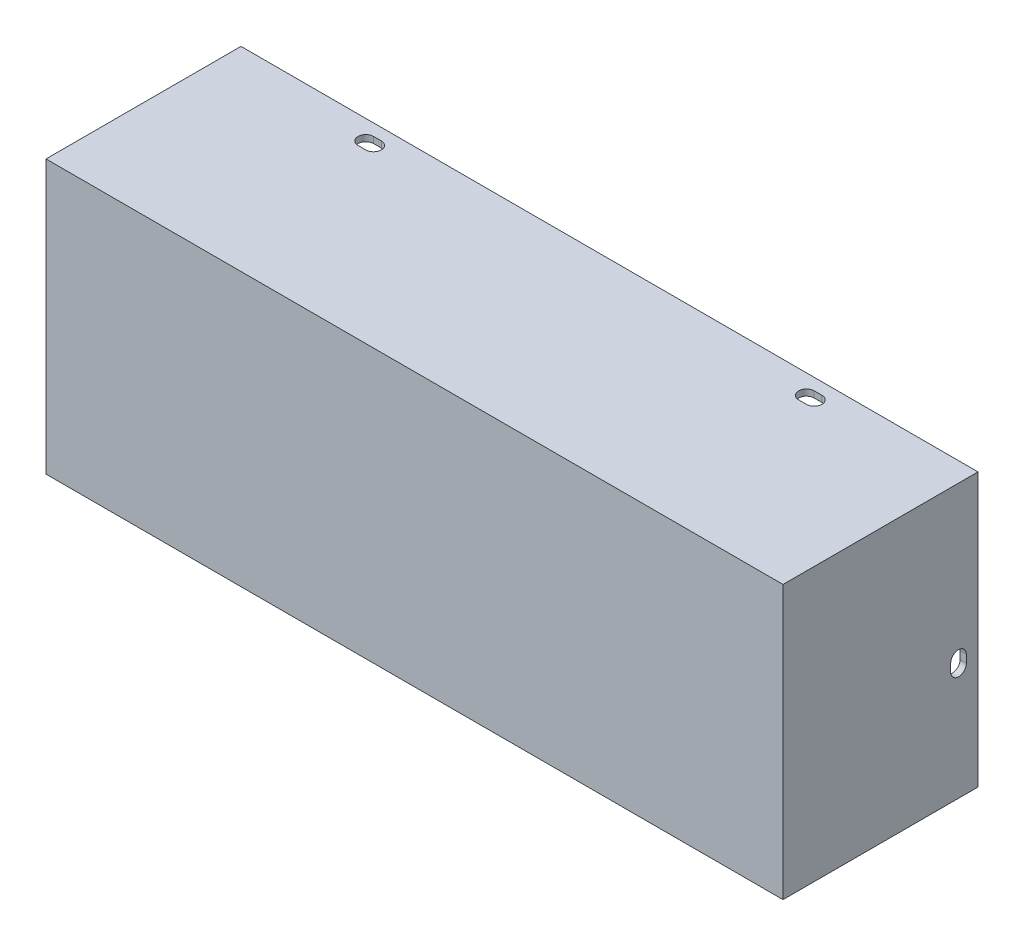
ISO-10303-21;
HEADER;
FILE_DESCRIPTION(('STEP AP214'),'2;1');
FILE_NAME('part.step','',(''),(''),'','','');
FILE_SCHEMA(('AUTOMOTIVE_DESIGN { 1 0 10303 214 1 1 1 1 }'));
ENDSEC;
DATA;
#1=APPLICATION_CONTEXT('core data for automotive mechanical design processes');
#2=APPLICATION_PROTOCOL_DEFINITION('international standard','automotive_design',2000,#1);
#3=PRODUCT_CONTEXT('',#1,'mechanical');
#4=PRODUCT('Part','Part','',(#3));
#5=PRODUCT_RELATED_PRODUCT_CATEGORY('part','',(#4));
#6=PRODUCT_DEFINITION_FORMATION('','',#4);
#7=PRODUCT_DEFINITION_CONTEXT('part definition',#1,'design');
#8=PRODUCT_DEFINITION('design','',#6,#7);
#9=PRODUCT_DEFINITION_SHAPE('','',#8);
#10=(LENGTH_UNIT() NAMED_UNIT(*) SI_UNIT(.MILLI.,.METRE.));
#11=(NAMED_UNIT(*) PLANE_ANGLE_UNIT() SI_UNIT($,.RADIAN.));
#12=(NAMED_UNIT(*) SI_UNIT($,.STERADIAN.) SOLID_ANGLE_UNIT());
#13=UNCERTAINTY_MEASURE_WITH_UNIT(LENGTH_MEASURE(1.E-05),#10,'distance_accuracy_value','');
#14=(GEOMETRIC_REPRESENTATION_CONTEXT(3) GLOBAL_UNCERTAINTY_ASSIGNED_CONTEXT((#13)) GLOBAL_UNIT_ASSIGNED_CONTEXT((#10,
#11,#12)) REPRESENTATION_CONTEXT('',''));
#15=CARTESIAN_POINT('',(0.,0.,0.));
#16=DIRECTION('',(0.,0.,1.));
#17=DIRECTION('',(1.,0.,0.));
#18=AXIS2_PLACEMENT_3D('',#15,#16,#17);
#19=CARTESIAN_POINT('',(-92.8,-33.9,48.4));
#20=DIRECTION('',(0.,0.,1.));
#21=DIRECTION('',(1.,0.,0.));
#22=AXIS2_PLACEMENT_3D('',#19,#20,#21);
#23=PLANE('',#22);
#24=DIRECTION('',(0.,1.,0.));
#25=VECTOR('',#24,1.);
#26=CARTESIAN_POINT('',(93.,32.9,48.4));
#27=LINE('',#26,#25);
#28=CARTESIAN_POINT('',(93.,-33.9,48.4));
#29=VERTEX_POINT('',#28);
#30=CARTESIAN_POINT('',(93.,32.9,48.4));
#31=VERTEX_POINT('',#30);
#32=EDGE_CURVE('E318',#29,#31,#27,.T.);
#33=ORIENTED_EDGE('',*,*,#32,.F.);
#34=DIRECTION('',(1.,0.,0.));
#35=VECTOR('',#34,1.);
#36=CARTESIAN_POINT('',(-92.8,-33.9,48.4));
#37=LINE('',#36,#35);
#38=CARTESIAN_POINT('',(-92.8,-33.9,48.4));
#39=VERTEX_POINT('',#38);
#40=EDGE_CURVE('E21',#39,#29,#37,.T.);
#41=ORIENTED_EDGE('',*,*,#40,.F.);
#42=DIRECTION('',(0.,-1.,0.));
#43=VECTOR('',#42,1.);
#44=CARTESIAN_POINT('',(-92.8,32.9,48.4));
#45=LINE('',#44,#43);
#46=CARTESIAN_POINT('',(-92.8,32.9,48.4));
#47=VERTEX_POINT('',#46);
#48=EDGE_CURVE('E324',#47,#39,#45,.T.);
#49=ORIENTED_EDGE('',*,*,#48,.F.);
#50=DIRECTION('',(-1.,0.,0.));
#51=VECTOR('',#50,1.);
#52=CARTESIAN_POINT('',(-92.8,32.9,48.4));
#53=LINE('',#52,#51);
#54=EDGE_CURVE('E11',#31,#47,#53,.T.);
#55=ORIENTED_EDGE('',*,*,#54,.F.);
#56=EDGE_LOOP('',(#33,#41,#49,#55));
#57=FACE_BOUND('',#56,.T.);
#58=ADVANCED_FACE('F17',(#57),#23,.F.);
#59=CARTESIAN_POINT('',(-92.8,32.9,48.4));
#60=DIRECTION('',(0.,-1.,0.));
#61=DIRECTION('',(0.,0.,-1.));
#62=AXIS2_PLACEMENT_3D('',#59,#60,#61);
#63=PLANE('',#62);
#64=CARTESIAN_POINT('',(57.6,32.9,5.));
#65=DIRECTION('',(0.,1.,0.));
#66=DIRECTION('',(0.,0.,1.));
#67=AXIS2_PLACEMENT_3D('',#64,#65,#66);
#68=CIRCLE('',#67,2.);
#69=CARTESIAN_POINT('',(57.6,32.9,7.));
#70=VERTEX_POINT('',#69);
#71=CARTESIAN_POINT('',(57.6,32.9,3.));
#72=VERTEX_POINT('',#71);
#73=EDGE_CURVE('E244',#70,#72,#68,.T.);
#74=ORIENTED_EDGE('',*,*,#73,.T.);
#75=DIRECTION('',(-1.,0.,0.));
#76=VECTOR('',#75,1.);
#77=CARTESIAN_POINT('',(55.6,32.9,3.));
#78=LINE('',#77,#76);
#79=CARTESIAN_POINT('',(55.6,32.9,3.));
#80=VERTEX_POINT('',#79);
#81=EDGE_CURVE('E252',#72,#80,#78,.T.);
#82=ORIENTED_EDGE('',*,*,#81,.T.);
#83=CARTESIAN_POINT('',(55.6,32.9,5.));
#84=DIRECTION('',(0.,1.,0.));
#85=DIRECTION('',(0.,0.,1.));
#86=AXIS2_PLACEMENT_3D('',#83,#84,#85);
#87=CIRCLE('',#86,2.);
#88=CARTESIAN_POINT('',(55.6,32.9,7.));
#89=VERTEX_POINT('',#88);
#90=EDGE_CURVE('E386',#80,#89,#87,.T.);
#91=ORIENTED_EDGE('',*,*,#90,.T.);
#92=DIRECTION('',(1.,0.,0.));
#93=VECTOR('',#92,1.);
#94=CARTESIAN_POINT('',(55.6,32.9,7.));
#95=LINE('',#94,#93);
#96=EDGE_CURVE('E329',#89,#70,#95,.T.);
#97=ORIENTED_EDGE('',*,*,#96,.T.);
#98=EDGE_LOOP('',(#74,#82,#91,#97));
#99=FACE_BOUND('',#98,.T.);
#100=CARTESIAN_POINT('',(-55.4,32.9,5.));
#101=DIRECTION('',(0.,1.,0.));
#102=DIRECTION('',(0.,0.,1.));
#103=AXIS2_PLACEMENT_3D('',#100,#101,#102);
#104=CIRCLE('',#103,2.);
#105=CARTESIAN_POINT('',(-55.4,32.9,7.));
#106=VERTEX_POINT('',#105);
#107=CARTESIAN_POINT('',(-55.4,32.9,3.));
#108=VERTEX_POINT('',#107);
#109=EDGE_CURVE('E40',#106,#108,#104,.T.);
#110=ORIENTED_EDGE('',*,*,#109,.T.);
#111=DIRECTION('',(-1.,0.,0.));
#112=VECTOR('',#111,1.);
#113=CARTESIAN_POINT('',(-57.4,32.9,3.));
#114=LINE('',#113,#112);
#115=CARTESIAN_POINT('',(-57.4,32.9,3.));
#116=VERTEX_POINT('',#115);
#117=EDGE_CURVE('E50',#108,#116,#114,.T.);
#118=ORIENTED_EDGE('',*,*,#117,.T.);
#119=CARTESIAN_POINT('',(-57.4,32.9,5.));
#120=DIRECTION('',(0.,1.,0.));
#121=DIRECTION('',(0.,0.,1.));
#122=AXIS2_PLACEMENT_3D('',#119,#120,#121);
#123=CIRCLE('',#122,2.);
#124=CARTESIAN_POINT('',(-57.4,32.9,7.));
#125=VERTEX_POINT('',#124);
#126=EDGE_CURVE('E219',#116,#125,#123,.T.);
#127=ORIENTED_EDGE('',*,*,#126,.T.);
#128=DIRECTION('',(1.,0.,0.));
#129=VECTOR('',#128,1.);
#130=CARTESIAN_POINT('',(-57.4,32.9,7.));
#131=LINE('',#130,#129);
#132=EDGE_CURVE('E222',#125,#106,#131,.T.);
#133=ORIENTED_EDGE('',*,*,#132,.T.);
#134=EDGE_LOOP('',(#110,#118,#127,#133));
#135=FACE_BOUND('',#134,.T.);
#136=DIRECTION('',(1.,0.,0.));
#137=VECTOR('',#136,1.);
#138=CARTESIAN_POINT('',(-92.8,32.9,0.));
#139=LINE('',#138,#137);
#140=CARTESIAN_POINT('',(-92.8,32.9,0.));
#141=VERTEX_POINT('',#140);
#142=CARTESIAN_POINT('',(93.,32.9,0.));
#143=VERTEX_POINT('',#142);
#144=EDGE_CURVE('E339',#141,#143,#139,.T.);
#145=ORIENTED_EDGE('',*,*,#144,.T.);
#146=DIRECTION('',(0.,0.,-1.));
#147=VECTOR('',#146,1.);
#148=CARTESIAN_POINT('',(93.,32.9,48.4));
#149=LINE('',#148,#147);
#150=EDGE_CURVE('E313',#31,#143,#149,.T.);
#151=ORIENTED_EDGE('',*,*,#150,.F.);
#152=ORIENTED_EDGE('',*,*,#54,.T.);
#153=DIRECTION('',(0.,0.,1.));
#154=VECTOR('',#153,1.);
#155=CARTESIAN_POINT('',(-92.8,32.9,48.4));
#156=LINE('',#155,#154);
#157=EDGE_CURVE('E360',#141,#47,#156,.T.);
#158=ORIENTED_EDGE('',*,*,#157,.F.);
#159=EDGE_LOOP('',(#145,#151,#152,#158));
#160=FACE_BOUND('',#159,.T.);
#161=ADVANCED_FACE('F19',(#99,#135,#160),#63,.T.);
#162=CARTESIAN_POINT('',(-92.8,-33.9,48.4));
#163=DIRECTION('',(0.,1.,0.));
#164=DIRECTION('',(1.,0.,0.));
#165=AXIS2_PLACEMENT_3D('',#162,#163,#164);
#166=PLANE('',#165);
#167=DIRECTION('',(0.,0.,1.));
#168=VECTOR('',#167,1.);
#169=CARTESIAN_POINT('',(93.,-33.9,48.4));
#170=LINE('',#169,#168);
#171=CARTESIAN_POINT('',(93.,-33.9,10.));
#172=VERTEX_POINT('',#171);
#173=EDGE_CURVE('E311',#172,#29,#170,.T.);
#174=ORIENTED_EDGE('',*,*,#173,.F.);
#175=DIRECTION('',(1.,0.,0.));
#176=VECTOR('',#175,1.);
#177=CARTESIAN_POINT('',(93.,-33.9,10.));
#178=LINE('',#177,#176);
#179=CARTESIAN_POINT('',(-92.8,-33.9,10.));
#180=VERTEX_POINT('',#179);
#181=EDGE_CURVE('E352',#180,#172,#178,.T.);
#182=ORIENTED_EDGE('',*,*,#181,.F.);
#183=DIRECTION('',(0.,0.,-1.));
#184=VECTOR('',#183,1.);
#185=CARTESIAN_POINT('',(-92.8,-33.9,48.4));
#186=LINE('',#185,#184);
#187=EDGE_CURVE('E319',#39,#180,#186,.T.);
#188=ORIENTED_EDGE('',*,*,#187,.F.);
#189=ORIENTED_EDGE('',*,*,#40,.T.);
#190=EDGE_LOOP('',(#174,#182,#188,#189));
#191=FACE_BOUND('',#190,.T.);
#192=ADVANCED_FACE('F1143',(#191),#166,.T.);
#193=CARTESIAN_POINT('',(-94.4,-4.5,7.));
#194=DIRECTION('',(0.,0.,1.));
#195=DIRECTION('',(1.,0.,0.));
#196=AXIS2_PLACEMENT_3D('',#193,#194,#195);
#197=PLANE('',#196);
#198=DIRECTION('',(0.,-1.,0.));
#199=VECTOR('',#198,1.);
#200=CARTESIAN_POINT('',(94.6,32.9,7.));
#201=LINE('',#200,#199);
#202=CARTESIAN_POINT('',(94.6,-4.5,7.));
#203=VERTEX_POINT('',#202);
#204=CARTESIAN_POINT('',(94.6,-6.5,7.));
#205=VERTEX_POINT('',#204);
#206=EDGE_CURVE('E312',#203,#205,#201,.T.);
#207=ORIENTED_EDGE('',*,*,#206,.T.);
#208=DIRECTION('',(-1.,0.,0.));
#209=VECTOR('',#208,1.);
#210=CARTESIAN_POINT('',(-94.4,-6.5,7.));
#211=LINE('',#210,#209);
#212=CARTESIAN_POINT('',(93.,-6.5,7.));
#213=VERTEX_POINT('',#212);
#214=EDGE_CURVE('E275',#205,#213,#211,.T.);
#215=ORIENTED_EDGE('',*,*,#214,.T.);
#216=DIRECTION('',(0.,-1.,0.));
#217=VECTOR('',#216,1.);
#218=CARTESIAN_POINT('',(93.,32.9,7.));
#219=LINE('',#218,#217);
#220=CARTESIAN_POINT('',(93.,-4.5,7.));
#221=VERTEX_POINT('',#220);
#222=EDGE_CURVE('E328',#221,#213,#219,.T.);
#223=ORIENTED_EDGE('',*,*,#222,.F.);
#224=DIRECTION('',(-1.,0.,0.));
#225=VECTOR('',#224,1.);
#226=CARTESIAN_POINT('',(-94.4,-4.5,7.));
#227=LINE('',#226,#225);
#228=EDGE_CURVE('E413',#203,#221,#227,.T.);
#229=ORIENTED_EDGE('',*,*,#228,.F.);
#230=EDGE_LOOP('',(#207,#215,#223,#229));
#231=FACE_BOUND('',#230,.T.);
#232=ADVANCED_FACE('F1087',(#231),#197,.F.);
#233=CARTESIAN_POINT('',(-94.4,-6.5,5.));
#234=DIRECTION('',(1.,0.,0.));
#235=DIRECTION('',(0.,1.,0.));
#236=AXIS2_PLACEMENT_3D('',#233,#234,#235);
#237=CYLINDRICAL_SURFACE('',#236,2.);
#238=CARTESIAN_POINT('',(94.6,-6.5,5.));
#239=DIRECTION('',(1.,0.,0.));
#240=DIRECTION('',(0.,1.,0.));
#241=AXIS2_PLACEMENT_3D('',#238,#239,#240);
#242=CIRCLE('',#241,2.);
#243=CARTESIAN_POINT('',(94.6,-6.5,3.));
#244=VERTEX_POINT('',#243);
#245=EDGE_CURVE('E305',#205,#244,#242,.T.);
#246=ORIENTED_EDGE('',*,*,#245,.T.);
#247=DIRECTION('',(-1.,0.,0.));
#248=VECTOR('',#247,1.);
#249=CARTESIAN_POINT('',(-94.4,-6.5,3.));
#250=LINE('',#249,#248);
#251=CARTESIAN_POINT('',(93.,-6.5,3.));
#252=VERTEX_POINT('',#251);
#253=EDGE_CURVE('E265',#244,#252,#250,.T.);
#254=ORIENTED_EDGE('',*,*,#253,.T.);
#255=CARTESIAN_POINT('',(93.,-6.5,5.));
#256=DIRECTION('',(1.,0.,0.));
#257=DIRECTION('',(0.,1.,0.));
#258=AXIS2_PLACEMENT_3D('',#255,#256,#257);
#259=CIRCLE('',#258,2.);
#260=EDGE_CURVE('E343',#213,#252,#259,.T.);
#261=ORIENTED_EDGE('',*,*,#260,.F.);
#262=ORIENTED_EDGE('',*,*,#214,.F.);
#263=EDGE_LOOP('',(#246,#254,#261,#262));
#264=FACE_BOUND('',#263,.T.);
#265=ADVANCED_FACE('F1082',(#264),#237,.F.);
#266=CARTESIAN_POINT('',(-94.4,-6.5,3.));
#267=DIRECTION('',(0.,0.,-1.));
#268=DIRECTION('',(0.,-1.,0.));
#269=AXIS2_PLACEMENT_3D('',#266,#267,#268);
#270=PLANE('',#269);
#271=DIRECTION('',(0.,1.,0.));
#272=VECTOR('',#271,1.);
#273=CARTESIAN_POINT('',(94.6,32.9,3.));
#274=LINE('',#273,#272);
#275=CARTESIAN_POINT('',(94.6,-4.5,3.));
#276=VERTEX_POINT('',#275);
#277=EDGE_CURVE('E302',#244,#276,#274,.T.);
#278=ORIENTED_EDGE('',*,*,#277,.T.);
#279=DIRECTION('',(-1.,0.,0.));
#280=VECTOR('',#279,1.);
#281=CARTESIAN_POINT('',(-94.4,-4.5,3.));
#282=LINE('',#281,#280);
#283=CARTESIAN_POINT('',(93.,-4.5,3.));
#284=VERTEX_POINT('',#283);
#285=EDGE_CURVE('E260',#276,#284,#282,.T.);
#286=ORIENTED_EDGE('',*,*,#285,.T.);
#287=DIRECTION('',(0.,1.,0.));
#288=VECTOR('',#287,1.);
#289=CARTESIAN_POINT('',(93.,32.9,3.));
#290=LINE('',#289,#288);
#291=EDGE_CURVE('E347',#252,#284,#290,.T.);
#292=ORIENTED_EDGE('',*,*,#291,.F.);
#293=ORIENTED_EDGE('',*,*,#253,.F.);
#294=EDGE_LOOP('',(#278,#286,#292,#293));
#295=FACE_BOUND('',#294,.T.);
#296=ADVANCED_FACE('F1086',(#295),#270,.F.);
#297=CARTESIAN_POINT('',(-55.4,24.5,5.));
#298=DIRECTION('',(0.,1.,0.));
#299=DIRECTION('',(0.,0.,1.));
#300=AXIS2_PLACEMENT_3D('',#297,#298,#299);
#301=CYLINDRICAL_SURFACE('',#300,2.);
#302=DIRECTION('',(0.,1.,0.));
#303=VECTOR('',#302,1.);
#304=CARTESIAN_POINT('',(-55.4,24.5,7.));
#305=LINE('',#304,#303);
#306=CARTESIAN_POINT('',(-55.4,34.5,7.));
#307=VERTEX_POINT('',#306);
#308=EDGE_CURVE('E236',#106,#307,#305,.T.);
#309=ORIENTED_EDGE('',*,*,#308,.T.);
#310=CARTESIAN_POINT('',(-55.4,34.5,5.));
#311=DIRECTION('',(0.,1.,0.));
#312=DIRECTION('',(0.,0.,1.));
#313=AXIS2_PLACEMENT_3D('',#310,#311,#312);
#314=CIRCLE('',#313,2.);
#315=CARTESIAN_POINT('',(-55.4,34.5,3.));
#316=VERTEX_POINT('',#315);
#317=EDGE_CURVE('E294',#307,#316,#314,.T.);
#318=ORIENTED_EDGE('',*,*,#317,.T.);
#319=DIRECTION('',(0.,-1.,0.));
#320=VECTOR('',#319,1.);
#321=CARTESIAN_POINT('',(-55.4,24.5,3.));
#322=LINE('',#321,#320);
#323=EDGE_CURVE('E228',#316,#108,#322,.T.);
#324=ORIENTED_EDGE('',*,*,#323,.T.);
#325=ORIENTED_EDGE('',*,*,#109,.F.);
#326=EDGE_LOOP('',(#309,#318,#324,#325));
#327=FACE_BOUND('',#326,.T.);
#328=ADVANCED_FACE('F1110',(#327),#301,.F.);
#329=CARTESIAN_POINT('',(-57.4,24.5,3.));
#330=DIRECTION('',(0.,0.,-1.));
#331=DIRECTION('',(0.,-1.,0.));
#332=AXIS2_PLACEMENT_3D('',#329,#330,#331);
#333=PLANE('',#332);
#334=ORIENTED_EDGE('',*,*,#323,.F.);
#335=DIRECTION('',(-1.,0.,0.));
#336=VECTOR('',#335,1.);
#337=CARTESIAN_POINT('',(-92.8,34.5,3.));
#338=LINE('',#337,#336);
#339=CARTESIAN_POINT('',(-57.4,34.5,3.));
#340=VERTEX_POINT('',#339);
#341=EDGE_CURVE('E291',#316,#340,#338,.T.);
#342=ORIENTED_EDGE('',*,*,#341,.T.);
#343=DIRECTION('',(0.,-1.,0.));
#344=VECTOR('',#343,1.);
#345=CARTESIAN_POINT('',(-57.4,24.5,3.));
#346=LINE('',#345,#344);
#347=EDGE_CURVE('E229',#340,#116,#346,.T.);
#348=ORIENTED_EDGE('',*,*,#347,.T.);
#349=ORIENTED_EDGE('',*,*,#117,.F.);
#350=EDGE_LOOP('',(#334,#342,#348,#349));
#351=FACE_BOUND('',#350,.T.);
#352=ADVANCED_FACE('F1099',(#351),#333,.F.);
#353=CARTESIAN_POINT('',(-57.4,24.5,5.));
#354=DIRECTION('',(0.,1.,0.));
#355=DIRECTION('',(0.,0.,1.));
#356=AXIS2_PLACEMENT_3D('',#353,#354,#355);
#357=CYLINDRICAL_SURFACE('',#356,2.);
#358=ORIENTED_EDGE('',*,*,#347,.F.);
#359=CARTESIAN_POINT('',(-57.4,34.5,5.));
#360=DIRECTION('',(0.,1.,0.));
#361=DIRECTION('',(0.,0.,1.));
#362=AXIS2_PLACEMENT_3D('',#359,#360,#361);
#363=CIRCLE('',#362,2.);
#364=CARTESIAN_POINT('',(-57.4,34.5,7.));
#365=VERTEX_POINT('',#364);
#366=EDGE_CURVE('E242',#340,#365,#363,.T.);
#367=ORIENTED_EDGE('',*,*,#366,.T.);
#368=DIRECTION('',(0.,-1.,0.));
#369=VECTOR('',#368,1.);
#370=CARTESIAN_POINT('',(-57.4,24.5,7.));
#371=LINE('',#370,#369);
#372=EDGE_CURVE('E234',#365,#125,#371,.T.);
#373=ORIENTED_EDGE('',*,*,#372,.T.);
#374=ORIENTED_EDGE('',*,*,#126,.F.);
#375=EDGE_LOOP('',(#358,#367,#373,#374));
#376=FACE_BOUND('',#375,.T.);
#377=ADVANCED_FACE('F240',(#376),#357,.F.);
#378=CARTESIAN_POINT('',(-57.4,24.5,7.));
#379=DIRECTION('',(0.,0.,1.));
#380=DIRECTION('',(1.,0.,0.));
#381=AXIS2_PLACEMENT_3D('',#378,#379,#380);
#382=PLANE('',#381);
#383=ORIENTED_EDGE('',*,*,#372,.F.);
#384=DIRECTION('',(1.,0.,0.));
#385=VECTOR('',#384,1.);
#386=CARTESIAN_POINT('',(-92.8,34.5,7.));
#387=LINE('',#386,#385);
#388=EDGE_CURVE('E298',#365,#307,#387,.T.);
#389=ORIENTED_EDGE('',*,*,#388,.T.);
#390=ORIENTED_EDGE('',*,*,#308,.F.);
#391=ORIENTED_EDGE('',*,*,#132,.F.);
#392=EDGE_LOOP('',(#383,#389,#390,#391));
#393=FACE_BOUND('',#392,.T.);
#394=ADVANCED_FACE('F232',(#393),#382,.F.);
#395=CARTESIAN_POINT('',(57.6,24.5,5.));
#396=DIRECTION('',(0.,1.,0.));
#397=DIRECTION('',(0.,0.,1.));
#398=AXIS2_PLACEMENT_3D('',#395,#396,#397);
#399=CYLINDRICAL_SURFACE('',#398,2.);
#400=DIRECTION('',(0.,1.,0.));
#401=VECTOR('',#400,1.);
#402=CARTESIAN_POINT('',(57.6,24.5,7.));
#403=LINE('',#402,#401);
#404=CARTESIAN_POINT('',(57.6,34.5,7.));
#405=VERTEX_POINT('',#404);
#406=EDGE_CURVE('E334',#70,#405,#403,.T.);
#407=ORIENTED_EDGE('',*,*,#406,.T.);
#408=CARTESIAN_POINT('',(57.6,34.5,5.));
#409=DIRECTION('',(0.,1.,0.));
#410=DIRECTION('',(0.,0.,1.));
#411=AXIS2_PLACEMENT_3D('',#408,#409,#410);
#412=CIRCLE('',#411,2.);
#413=CARTESIAN_POINT('',(57.6,34.5,3.));
#414=VERTEX_POINT('',#413);
#415=EDGE_CURVE('E281',#405,#414,#412,.T.);
#416=ORIENTED_EDGE('',*,*,#415,.T.);
#417=DIRECTION('',(0.,-1.,0.));
#418=VECTOR('',#417,1.);
#419=CARTESIAN_POINT('',(57.6,24.5,3.));
#420=LINE('',#419,#418);
#421=EDGE_CURVE('E387',#414,#72,#420,.T.);
#422=ORIENTED_EDGE('',*,*,#421,.T.);
#423=ORIENTED_EDGE('',*,*,#73,.F.);
#424=EDGE_LOOP('',(#407,#416,#422,#423));
#425=FACE_BOUND('',#424,.T.);
#426=ADVANCED_FACE('F1053',(#425),#399,.F.);
#427=CARTESIAN_POINT('',(55.6,24.5,3.));
#428=DIRECTION('',(0.,0.,-1.));
#429=DIRECTION('',(0.,-1.,0.));
#430=AXIS2_PLACEMENT_3D('',#427,#428,#429);
#431=PLANE('',#430);
#432=ORIENTED_EDGE('',*,*,#421,.F.);
#433=DIRECTION('',(-1.,0.,0.));
#434=VECTOR('',#433,1.);
#435=CARTESIAN_POINT('',(-92.8,34.5,3.));
#436=LINE('',#435,#434);
#437=CARTESIAN_POINT('',(55.6,34.5,3.));
#438=VERTEX_POINT('',#437);
#439=EDGE_CURVE('E279',#414,#438,#436,.T.);
#440=ORIENTED_EDGE('',*,*,#439,.T.);
#441=DIRECTION('',(0.,-1.,0.));
#442=VECTOR('',#441,1.);
#443=CARTESIAN_POINT('',(55.6,24.5,3.));
#444=LINE('',#443,#442);
#445=EDGE_CURVE('E333',#438,#80,#444,.T.);
#446=ORIENTED_EDGE('',*,*,#445,.T.);
#447=ORIENTED_EDGE('',*,*,#81,.F.);
#448=EDGE_LOOP('',(#432,#440,#446,#447));
#449=FACE_BOUND('',#448,.T.);
#450=ADVANCED_FACE('F1041',(#449),#431,.F.);
#451=CARTESIAN_POINT('',(55.6,24.5,5.));
#452=DIRECTION('',(0.,1.,0.));
#453=DIRECTION('',(0.,0.,1.));
#454=AXIS2_PLACEMENT_3D('',#451,#452,#453);
#455=CYLINDRICAL_SURFACE('',#454,2.);
#456=ORIENTED_EDGE('',*,*,#445,.F.);
#457=CARTESIAN_POINT('',(55.6,34.5,5.));
#458=DIRECTION('',(0.,1.,0.));
#459=DIRECTION('',(0.,0.,1.));
#460=AXIS2_PLACEMENT_3D('',#457,#458,#459);
#461=CIRCLE('',#460,2.);
#462=CARTESIAN_POINT('',(55.6,34.5,7.));
#463=VERTEX_POINT('',#462);
#464=EDGE_CURVE('E476',#438,#463,#461,.T.);
#465=ORIENTED_EDGE('',*,*,#464,.T.);
#466=DIRECTION('',(0.,-1.,0.));
#467=VECTOR('',#466,1.);
#468=CARTESIAN_POINT('',(55.6,24.5,7.));
#469=LINE('',#468,#467);
#470=EDGE_CURVE('E335',#463,#89,#469,.T.);
#471=ORIENTED_EDGE('',*,*,#470,.T.);
#472=ORIENTED_EDGE('',*,*,#90,.F.);
#473=EDGE_LOOP('',(#456,#465,#471,#472));
#474=FACE_BOUND('',#473,.T.);
#475=ADVANCED_FACE('F997',(#474),#455,.F.);
#476=CARTESIAN_POINT('',(55.6,24.5,7.));
#477=DIRECTION('',(0.,0.,1.));
#478=DIRECTION('',(1.,0.,0.));
#479=AXIS2_PLACEMENT_3D('',#476,#477,#478);
#480=PLANE('',#479);
#481=ORIENTED_EDGE('',*,*,#470,.F.);
#482=DIRECTION('',(1.,0.,0.));
#483=VECTOR('',#482,1.);
#484=CARTESIAN_POINT('',(-92.8,34.5,7.));
#485=LINE('',#484,#483);
#486=EDGE_CURVE('E285',#463,#405,#485,.T.);
#487=ORIENTED_EDGE('',*,*,#486,.T.);
#488=ORIENTED_EDGE('',*,*,#406,.F.);
#489=ORIENTED_EDGE('',*,*,#96,.F.);
#490=EDGE_LOOP('',(#481,#487,#488,#489));
#491=FACE_BOUND('',#490,.T.);
#492=ADVANCED_FACE('F993',(#491),#480,.F.);
#493=CARTESIAN_POINT('',(-92.8,-33.9,0.));
#494=DIRECTION('',(0.,0.,1.));
#495=DIRECTION('',(1.,0.,0.));
#496=AXIS2_PLACEMENT_3D('',#493,#494,#495);
#497=PLANE('',#496);
#498=ORIENTED_EDGE('',*,*,#144,.F.);
#499=DIRECTION('',(0.,1.,0.));
#500=VECTOR('',#499,1.);
#501=CARTESIAN_POINT('',(-92.8,32.9,0.));
#502=LINE('',#501,#500);
#503=CARTESIAN_POINT('',(-92.8,-35.5,0.));
#504=VERTEX_POINT('',#503);
#505=EDGE_CURVE('E356',#504,#141,#502,.T.);
#506=ORIENTED_EDGE('',*,*,#505,.F.);
#507=DIRECTION('',(1.,0.,0.));
#508=VECTOR('',#507,1.);
#509=CARTESIAN_POINT('',(-92.8,-35.5,0.));
#510=LINE('',#509,#508);
#511=CARTESIAN_POINT('',(-94.4,-35.5,0.));
#512=VERTEX_POINT('',#511);
#513=EDGE_CURVE('E417',#512,#504,#510,.T.);
#514=ORIENTED_EDGE('',*,*,#513,.F.);
#515=DIRECTION('',(0.,1.,0.));
#516=VECTOR('',#515,1.);
#517=CARTESIAN_POINT('',(-94.4,32.9,0.));
#518=LINE('',#517,#516);
#519=CARTESIAN_POINT('',(-94.4,34.5,0.));
#520=VERTEX_POINT('',#519);
#521=EDGE_CURVE('E451',#512,#520,#518,.T.);
#522=ORIENTED_EDGE('',*,*,#521,.T.);
#523=DIRECTION('',(1.,0.,0.));
#524=VECTOR('',#523,1.);
#525=CARTESIAN_POINT('',(-92.8,34.5,0.));
#526=LINE('',#525,#524);
#527=CARTESIAN_POINT('',(94.6,34.5,0.));
#528=VERTEX_POINT('',#527);
#529=EDGE_CURVE('E469',#520,#528,#526,.T.);
#530=ORIENTED_EDGE('',*,*,#529,.T.);
#531=DIRECTION('',(0.,-1.,0.));
#532=VECTOR('',#531,1.);
#533=CARTESIAN_POINT('',(94.6,32.9,0.));
#534=LINE('',#533,#532);
#535=CARTESIAN_POINT('',(94.6,-35.5,0.));
#536=VERTEX_POINT('',#535);
#537=EDGE_CURVE('E306',#528,#536,#534,.T.);
#538=ORIENTED_EDGE('',*,*,#537,.T.);
#539=DIRECTION('',(1.,0.,0.));
#540=VECTOR('',#539,1.);
#541=CARTESIAN_POINT('',(-92.8,-35.5,0.));
#542=LINE('',#541,#540);
#543=CARTESIAN_POINT('',(93.,-35.5,0.));
#544=VERTEX_POINT('',#543);
#545=EDGE_CURVE('E430',#544,#536,#542,.T.);
#546=ORIENTED_EDGE('',*,*,#545,.F.);
#547=DIRECTION('',(0.,-1.,0.));
#548=VECTOR('',#547,1.);
#549=CARTESIAN_POINT('',(93.,32.9,0.));
#550=LINE('',#549,#548);
#551=EDGE_CURVE('E317',#143,#544,#550,.T.);
#552=ORIENTED_EDGE('',*,*,#551,.F.);
#553=EDGE_LOOP('',(#498,#506,#514,#522,#530,#538,#546,#552));
#554=FACE_BOUND('',#553,.T.);
#555=ADVANCED_FACE('F539',(#554),#497,.F.);
#556=CARTESIAN_POINT('',(-94.4,-6.5,3.));
#557=DIRECTION('',(0.,0.,-1.));
#558=DIRECTION('',(0.,-1.,0.));
#559=AXIS2_PLACEMENT_3D('',#556,#557,#558);
#560=PLANE('',#559);
#561=DIRECTION('',(0.,-1.,0.));
#562=VECTOR('',#561,1.);
#563=CARTESIAN_POINT('',(-94.4,32.9,3.));
#564=LINE('',#563,#562);
#565=CARTESIAN_POINT('',(-94.4,-4.5,3.));
#566=VERTEX_POINT('',#565);
#567=CARTESIAN_POINT('',(-94.4,-6.5,3.));
#568=VERTEX_POINT('',#567);
#569=EDGE_CURVE('E464',#566,#568,#564,.T.);
#570=ORIENTED_EDGE('',*,*,#569,.T.);
#571=DIRECTION('',(1.,0.,0.));
#572=VECTOR('',#571,1.);
#573=CARTESIAN_POINT('',(-94.4,-6.5,3.));
#574=LINE('',#573,#572);
#575=CARTESIAN_POINT('',(-92.8,-6.5,3.));
#576=VERTEX_POINT('',#575);
#577=EDGE_CURVE('E377',#568,#576,#574,.T.);
#578=ORIENTED_EDGE('',*,*,#577,.T.);
#579=DIRECTION('',(0.,-1.,0.));
#580=VECTOR('',#579,1.);
#581=CARTESIAN_POINT('',(-92.8,32.9,3.));
#582=LINE('',#581,#580);
#583=CARTESIAN_POINT('',(-92.8,-4.5,3.));
#584=VERTEX_POINT('',#583);
#585=EDGE_CURVE('E364',#584,#576,#582,.T.);
#586=ORIENTED_EDGE('',*,*,#585,.F.);
#587=DIRECTION('',(1.,0.,0.));
#588=VECTOR('',#587,1.);
#589=CARTESIAN_POINT('',(-94.4,-4.5,3.));
#590=LINE('',#589,#588);
#591=EDGE_CURVE('E373',#566,#584,#590,.T.);
#592=ORIENTED_EDGE('',*,*,#591,.F.);
#593=EDGE_LOOP('',(#570,#578,#586,#592));
#594=FACE_BOUND('',#593,.T.);
#595=ADVANCED_FACE('F916',(#594),#560,.F.);
#596=CARTESIAN_POINT('',(-94.4,-6.5,5.));
#597=DIRECTION('',(1.,0.,0.));
#598=DIRECTION('',(0.,1.,0.));
#599=AXIS2_PLACEMENT_3D('',#596,#597,#598);
#600=CYLINDRICAL_SURFACE('',#599,2.);
#601=CARTESIAN_POINT('',(-94.4,-6.5,5.));
#602=DIRECTION('',(-1.,0.,0.));
#603=DIRECTION('',(0.,1.,0.));
#604=AXIS2_PLACEMENT_3D('',#601,#602,#603);
#605=CIRCLE('',#604,2.);
#606=CARTESIAN_POINT('',(-94.4,-6.5,7.));
#607=VERTEX_POINT('',#606);
#608=EDGE_CURVE('E460',#568,#607,#605,.T.);
#609=ORIENTED_EDGE('',*,*,#608,.T.);
#610=DIRECTION('',(1.,0.,0.));
#611=VECTOR('',#610,1.);
#612=CARTESIAN_POINT('',(-94.4,-6.5,7.));
#613=LINE('',#612,#611);
#614=CARTESIAN_POINT('',(-92.8,-6.5,7.));
#615=VERTEX_POINT('',#614);
#616=EDGE_CURVE('E374',#607,#615,#613,.T.);
#617=ORIENTED_EDGE('',*,*,#616,.T.);
#618=CARTESIAN_POINT('',(-92.8,-6.5,5.));
#619=DIRECTION('',(-1.,0.,0.));
#620=DIRECTION('',(0.,1.,0.));
#621=AXIS2_PLACEMENT_3D('',#618,#619,#620);
#622=CIRCLE('',#621,2.);
#623=EDGE_CURVE('E353',#576,#615,#622,.T.);
#624=ORIENTED_EDGE('',*,*,#623,.F.);
#625=ORIENTED_EDGE('',*,*,#577,.F.);
#626=EDGE_LOOP('',(#609,#617,#624,#625));
#627=FACE_BOUND('',#626,.T.);
#628=ADVANCED_FACE('F874',(#627),#600,.F.);
#629=CARTESIAN_POINT('',(-94.4,-4.5,7.));
#630=DIRECTION('',(0.,0.,1.));
#631=DIRECTION('',(1.,0.,0.));
#632=AXIS2_PLACEMENT_3D('',#629,#630,#631);
#633=PLANE('',#632);
#634=DIRECTION('',(0.,1.,0.));
#635=VECTOR('',#634,1.);
#636=CARTESIAN_POINT('',(-94.4,32.9,7.));
#637=LINE('',#636,#635);
#638=CARTESIAN_POINT('',(-94.4,-4.5,7.));
#639=VERTEX_POINT('',#638);
#640=EDGE_CURVE('E456',#607,#639,#637,.T.);
#641=ORIENTED_EDGE('',*,*,#640,.T.);
#642=DIRECTION('',(1.,0.,0.));
#643=VECTOR('',#642,1.);
#644=CARTESIAN_POINT('',(-94.4,-4.5,7.));
#645=LINE('',#644,#643);
#646=CARTESIAN_POINT('',(-92.8,-4.5,7.));
#647=VERTEX_POINT('',#646);
#648=EDGE_CURVE('E511',#639,#647,#645,.T.);
#649=ORIENTED_EDGE('',*,*,#648,.T.);
#650=DIRECTION('',(0.,1.,0.));
#651=VECTOR('',#650,1.);
#652=CARTESIAN_POINT('',(-92.8,32.9,7.));
#653=LINE('',#652,#651);
#654=EDGE_CURVE('E348',#615,#647,#653,.T.);
#655=ORIENTED_EDGE('',*,*,#654,.F.);
#656=ORIENTED_EDGE('',*,*,#616,.F.);
#657=EDGE_LOOP('',(#641,#649,#655,#656));
#658=FACE_BOUND('',#657,.T.);
#659=ADVANCED_FACE('F869',(#658),#633,.F.);
#660=CARTESIAN_POINT('',(93.,-52.0932203389829,10.));
#661=DIRECTION('',(0.,0.,-1.));
#662=DIRECTION('',(0.,-1.,0.));
#663=AXIS2_PLACEMENT_3D('',#660,#661,#662);
#664=PLANE('',#663);
#665=DIRECTION('',(-1.,0.,0.));
#666=VECTOR('',#665,1.);
#667=CARTESIAN_POINT('',(-92.8,-35.5,10.));
#668=LINE('',#667,#666);
#669=CARTESIAN_POINT('',(93.,-35.5,10.));
#670=VERTEX_POINT('',#669);
#671=CARTESIAN_POINT('',(-92.8,-35.5,10.));
#672=VERTEX_POINT('',#671);
#673=EDGE_CURVE('E441',#670,#672,#668,.T.);
#674=ORIENTED_EDGE('',*,*,#673,.T.);
#675=DIRECTION('',(0.,-1.,0.));
#676=VECTOR('',#675,1.);
#677=CARTESIAN_POINT('',(-92.8,32.9,10.));
#678=LINE('',#677,#676);
#679=EDGE_CURVE('E323',#180,#672,#678,.T.);
#680=ORIENTED_EDGE('',*,*,#679,.F.);
#681=ORIENTED_EDGE('',*,*,#181,.T.);
#682=DIRECTION('',(0.,1.,0.));
#683=VECTOR('',#682,1.);
#684=CARTESIAN_POINT('',(93.,32.9,10.));
#685=LINE('',#684,#683);
#686=EDGE_CURVE('E307',#670,#172,#685,.T.);
#687=ORIENTED_EDGE('',*,*,#686,.F.);
#688=EDGE_LOOP('',(#674,#680,#681,#687));
#689=FACE_BOUND('',#688,.T.);
#690=ADVANCED_FACE('F873',(#689),#664,.T.);
#691=CARTESIAN_POINT('',(-92.8,32.9,48.4));
#692=DIRECTION('',(1.,0.,0.));
#693=DIRECTION('',(0.,1.,0.));
#694=AXIS2_PLACEMENT_3D('',#691,#692,#693);
#695=PLANE('',#694);
#696=ORIENTED_EDGE('',*,*,#585,.T.);
#697=ORIENTED_EDGE('',*,*,#623,.T.);
#698=ORIENTED_EDGE('',*,*,#654,.T.);
#699=CARTESIAN_POINT('',(-92.8,-4.5,5.));
#700=DIRECTION('',(-1.,0.,0.));
#701=DIRECTION('',(0.,1.,0.));
#702=AXIS2_PLACEMENT_3D('',#699,#700,#701);
#703=CIRCLE('',#702,2.);
#704=EDGE_CURVE('E519',#647,#584,#703,.T.);
#705=ORIENTED_EDGE('',*,*,#704,.T.);
#706=EDGE_LOOP('',(#696,#697,#698,#705));
#707=FACE_BOUND('',#706,.T.);
#708=ORIENTED_EDGE('',*,*,#48,.T.);
#709=ORIENTED_EDGE('',*,*,#187,.T.);
#710=ORIENTED_EDGE('',*,*,#679,.T.);
#711=DIRECTION('',(0.,0.,-1.));
#712=VECTOR('',#711,1.);
#713=CARTESIAN_POINT('',(-92.8,-35.5,48.4));
#714=LINE('',#713,#712);
#715=EDGE_CURVE('E421',#672,#504,#714,.T.);
#716=ORIENTED_EDGE('',*,*,#715,.T.);
#717=ORIENTED_EDGE('',*,*,#505,.T.);
#718=ORIENTED_EDGE('',*,*,#157,.T.);
#719=EDGE_LOOP('',(#708,#709,#710,#716,#717,#718));
#720=FACE_BOUND('',#719,.T.);
#721=ADVANCED_FACE('F908',(#707,#720),#695,.T.);
#722=CARTESIAN_POINT('',(93.,32.9,48.4));
#723=DIRECTION('',(-1.,0.,0.));
#724=DIRECTION('',(0.,1.,0.));
#725=AXIS2_PLACEMENT_3D('',#722,#723,#724);
#726=PLANE('',#725);
#727=ORIENTED_EDGE('',*,*,#222,.T.);
#728=ORIENTED_EDGE('',*,*,#260,.T.);
#729=ORIENTED_EDGE('',*,*,#291,.T.);
#730=CARTESIAN_POINT('',(93.,-4.5,5.));
#731=DIRECTION('',(1.,0.,0.));
#732=DIRECTION('',(0.,1.,0.));
#733=AXIS2_PLACEMENT_3D('',#730,#731,#732);
#734=CIRCLE('',#733,2.);
#735=EDGE_CURVE('E507',#284,#221,#734,.T.);
#736=ORIENTED_EDGE('',*,*,#735,.T.);
#737=EDGE_LOOP('',(#727,#728,#729,#736));
#738=FACE_BOUND('',#737,.T.);
#739=ORIENTED_EDGE('',*,*,#686,.T.);
#740=ORIENTED_EDGE('',*,*,#173,.T.);
#741=ORIENTED_EDGE('',*,*,#32,.T.);
#742=ORIENTED_EDGE('',*,*,#150,.T.);
#743=ORIENTED_EDGE('',*,*,#551,.T.);
#744=DIRECTION('',(0.,0.,1.));
#745=VECTOR('',#744,1.);
#746=CARTESIAN_POINT('',(93.,-35.5,48.4));
#747=LINE('',#746,#745);
#748=EDGE_CURVE('E445',#544,#670,#747,.T.);
#749=ORIENTED_EDGE('',*,*,#748,.T.);
#750=EDGE_LOOP('',(#739,#740,#741,#742,#743,#749));
#751=FACE_BOUND('',#750,.T.);
#752=ADVANCED_FACE('F556',(#738,#751),#726,.T.);
#753=CARTESIAN_POINT('',(94.6,32.9,48.4));
#754=DIRECTION('',(-1.,0.,0.));
#755=DIRECTION('',(0.,1.,0.));
#756=AXIS2_PLACEMENT_3D('',#753,#754,#755);
#757=PLANE('',#756);
#758=ORIENTED_EDGE('',*,*,#277,.F.);
#759=ORIENTED_EDGE('',*,*,#245,.F.);
#760=ORIENTED_EDGE('',*,*,#206,.F.);
#761=CARTESIAN_POINT('',(94.6,-4.5,5.));
#762=DIRECTION('',(1.,0.,0.));
#763=DIRECTION('',(0.,1.,0.));
#764=AXIS2_PLACEMENT_3D('',#761,#762,#763);
#765=CIRCLE('',#764,2.);
#766=EDGE_CURVE('E493',#276,#203,#765,.T.);
#767=ORIENTED_EDGE('',*,*,#766,.F.);
#768=EDGE_LOOP('',(#758,#759,#760,#767));
#769=FACE_BOUND('',#768,.T.);
#770=DIRECTION('',(0.,1.,0.));
#771=VECTOR('',#770,1.);
#772=CARTESIAN_POINT('',(94.6,-33.9,50.));
#773=LINE('',#772,#771);
#774=CARTESIAN_POINT('',(94.6,-35.5,50.));
#775=VERTEX_POINT('',#774);
#776=CARTESIAN_POINT('',(94.6,34.5,50.));
#777=VERTEX_POINT('',#776);
#778=EDGE_CURVE('E422',#775,#777,#773,.T.);
#779=ORIENTED_EDGE('',*,*,#778,.F.);
#780=DIRECTION('',(0.,0.,-1.));
#781=VECTOR('',#780,1.);
#782=CARTESIAN_POINT('',(94.6,-35.5,48.4));
#783=LINE('',#782,#781);
#784=EDGE_CURVE('E434',#775,#536,#783,.T.);
#785=ORIENTED_EDGE('',*,*,#784,.T.);
#786=ORIENTED_EDGE('',*,*,#537,.F.);
#787=DIRECTION('',(0.,0.,1.));
#788=VECTOR('',#787,1.);
#789=CARTESIAN_POINT('',(94.6,34.5,48.4));
#790=LINE('',#789,#788);
#791=EDGE_CURVE('E465',#528,#777,#790,.T.);
#792=ORIENTED_EDGE('',*,*,#791,.T.);
#793=EDGE_LOOP('',(#779,#785,#786,#792));
#794=FACE_BOUND('',#793,.T.);
#795=ADVANCED_FACE('F545',(#769,#794),#757,.F.);
#796=CARTESIAN_POINT('',(-92.8,34.5,48.4));
#797=DIRECTION('',(0.,-1.,0.));
#798=DIRECTION('',(0.,0.,-1.));
#799=AXIS2_PLACEMENT_3D('',#796,#797,#798);
#800=PLANE('',#799);
#801=ORIENTED_EDGE('',*,*,#366,.F.);
#802=ORIENTED_EDGE('',*,*,#341,.F.);
#803=ORIENTED_EDGE('',*,*,#317,.F.);
#804=ORIENTED_EDGE('',*,*,#388,.F.);
#805=EDGE_LOOP('',(#801,#802,#803,#804));
#806=FACE_BOUND('',#805,.T.);
#807=ORIENTED_EDGE('',*,*,#464,.F.);
#808=ORIENTED_EDGE('',*,*,#439,.F.);
#809=ORIENTED_EDGE('',*,*,#415,.F.);
#810=ORIENTED_EDGE('',*,*,#486,.F.);
#811=EDGE_LOOP('',(#807,#808,#809,#810));
#812=FACE_BOUND('',#811,.T.);
#813=DIRECTION('',(-1.,0.,0.));
#814=VECTOR('',#813,1.);
#815=CARTESIAN_POINT('',(-92.8,34.5,50.));
#816=LINE('',#815,#814);
#817=CARTESIAN_POINT('',(-94.4,34.5,50.));
#818=VERTEX_POINT('',#817);
#819=EDGE_CURVE('E426',#777,#818,#816,.T.);
#820=ORIENTED_EDGE('',*,*,#819,.F.);
#821=ORIENTED_EDGE('',*,*,#791,.F.);
#822=ORIENTED_EDGE('',*,*,#529,.F.);
#823=DIRECTION('',(0.,0.,1.));
#824=VECTOR('',#823,1.);
#825=CARTESIAN_POINT('',(-94.4,34.5,48.4));
#826=LINE('',#825,#824);
#827=EDGE_CURVE('E449',#520,#818,#826,.T.);
#828=ORIENTED_EDGE('',*,*,#827,.T.);
#829=EDGE_LOOP('',(#820,#821,#822,#828));
#830=FACE_BOUND('',#829,.T.);
#831=ADVANCED_FACE('F959',(#806,#812,#830),#800,.F.);
#832=CARTESIAN_POINT('',(-94.4,32.9,48.4));
#833=DIRECTION('',(1.,0.,0.));
#834=DIRECTION('',(0.,1.,0.));
#835=AXIS2_PLACEMENT_3D('',#832,#833,#834);
#836=PLANE('',#835);
#837=ORIENTED_EDGE('',*,*,#640,.F.);
#838=ORIENTED_EDGE('',*,*,#608,.F.);
#839=ORIENTED_EDGE('',*,*,#569,.F.);
#840=CARTESIAN_POINT('',(-94.4,-4.5,5.));
#841=DIRECTION('',(-1.,0.,0.));
#842=DIRECTION('',(0.,1.,0.));
#843=AXIS2_PLACEMENT_3D('',#840,#841,#842);
#844=CIRCLE('',#843,2.);
#845=EDGE_CURVE('E527',#639,#566,#844,.T.);
#846=ORIENTED_EDGE('',*,*,#845,.F.);
#847=EDGE_LOOP('',(#837,#838,#839,#846));
#848=FACE_BOUND('',#847,.T.);
#849=DIRECTION('',(0.,-1.,0.));
#850=VECTOR('',#849,1.);
#851=CARTESIAN_POINT('',(-94.4,-33.9,50.));
#852=LINE('',#851,#850);
#853=CARTESIAN_POINT('',(-94.4,-35.5,50.));
#854=VERTEX_POINT('',#853);
#855=EDGE_CURVE('E408',#818,#854,#852,.T.);
#856=ORIENTED_EDGE('',*,*,#855,.F.);
#857=ORIENTED_EDGE('',*,*,#827,.F.);
#858=ORIENTED_EDGE('',*,*,#521,.F.);
#859=DIRECTION('',(0.,0.,1.));
#860=VECTOR('',#859,1.);
#861=CARTESIAN_POINT('',(-94.4,-35.5,48.4));
#862=LINE('',#861,#860);
#863=EDGE_CURVE('E404',#512,#854,#862,.T.);
#864=ORIENTED_EDGE('',*,*,#863,.T.);
#865=EDGE_LOOP('',(#856,#857,#858,#864));
#866=FACE_BOUND('',#865,.T.);
#867=ADVANCED_FACE('F585',(#848,#866),#836,.F.);
#868=CARTESIAN_POINT('',(-92.8,-35.5,48.4));
#869=DIRECTION('',(0.,1.,0.));
#870=DIRECTION('',(1.,0.,0.));
#871=AXIS2_PLACEMENT_3D('',#868,#869,#870);
#872=PLANE('',#871);
#873=ORIENTED_EDGE('',*,*,#545,.T.);
#874=ORIENTED_EDGE('',*,*,#784,.F.);
#875=DIRECTION('',(1.,0.,0.));
#876=VECTOR('',#875,1.);
#877=CARTESIAN_POINT('',(-92.8,-35.5,50.));
#878=LINE('',#877,#876);
#879=EDGE_CURVE('E412',#854,#775,#878,.T.);
#880=ORIENTED_EDGE('',*,*,#879,.F.);
#881=ORIENTED_EDGE('',*,*,#863,.F.);
#882=ORIENTED_EDGE('',*,*,#513,.T.);
#883=ORIENTED_EDGE('',*,*,#715,.F.);
#884=ORIENTED_EDGE('',*,*,#673,.F.);
#885=ORIENTED_EDGE('',*,*,#748,.F.);
#886=EDGE_LOOP('',(#873,#874,#880,#881,#882,#883,#884,#885));
#887=FACE_BOUND('',#886,.T.);
#888=ADVANCED_FACE('F550',(#887),#872,.F.);
#889=CARTESIAN_POINT('',(-92.8,-33.9,50.));
#890=DIRECTION('',(0.,0.,1.));
#891=DIRECTION('',(1.,0.,0.));
#892=AXIS2_PLACEMENT_3D('',#889,#890,#891);
#893=PLANE('',#892);
#894=ORIENTED_EDGE('',*,*,#855,.T.);
#895=ORIENTED_EDGE('',*,*,#879,.T.);
#896=ORIENTED_EDGE('',*,*,#778,.T.);
#897=ORIENTED_EDGE('',*,*,#819,.T.);
#898=EDGE_LOOP('',(#894,#895,#896,#897));
#899=FACE_BOUND('',#898,.T.);
#900=ADVANCED_FACE('F886',(#899),#893,.T.);
#901=CARTESIAN_POINT('',(-94.4,-4.5,5.));
#902=DIRECTION('',(1.,0.,0.));
#903=DIRECTION('',(0.,1.,0.));
#904=AXIS2_PLACEMENT_3D('',#901,#902,#903);
#905=CYLINDRICAL_SURFACE('',#904,2.);
#906=ORIENTED_EDGE('',*,*,#735,.F.);
#907=ORIENTED_EDGE('',*,*,#285,.F.);
#908=ORIENTED_EDGE('',*,*,#766,.T.);
#909=ORIENTED_EDGE('',*,*,#228,.T.);
#910=EDGE_LOOP('',(#906,#907,#908,#909));
#911=FACE_BOUND('',#910,.T.);
#912=ADVANCED_FACE('F860',(#911),#905,.F.);
#913=CARTESIAN_POINT('',(-94.4,-4.5,5.));
#914=DIRECTION('',(1.,0.,0.));
#915=DIRECTION('',(0.,1.,0.));
#916=AXIS2_PLACEMENT_3D('',#913,#914,#915);
#917=CYLINDRICAL_SURFACE('',#916,2.);
#918=ORIENTED_EDGE('',*,*,#845,.T.);
#919=ORIENTED_EDGE('',*,*,#591,.T.);
#920=ORIENTED_EDGE('',*,*,#704,.F.);
#921=ORIENTED_EDGE('',*,*,#648,.F.);
#922=EDGE_LOOP('',(#918,#919,#920,#921));
#923=FACE_BOUND('',#922,.T.);
#924=ADVANCED_FACE('F855',(#923),#917,.F.);
#925=CLOSED_SHELL('',(#58,#161,#192,#232,#265,#296,#328,#352,#377,#394,#426,#450,#475,#492,#555,
#595,#628,#659,#690,#721,#752,#795,#831,#867,#888,#900,#912,#924));
#926=MANIFOLD_SOLID_BREP('B1',#925);
#927=ADVANCED_BREP_SHAPE_REPRESENTATION('',(#18,#926),#14);
#928=SHAPE_DEFINITION_REPRESENTATION(#9,#927);
ENDSEC;
END-ISO-10303-21;
